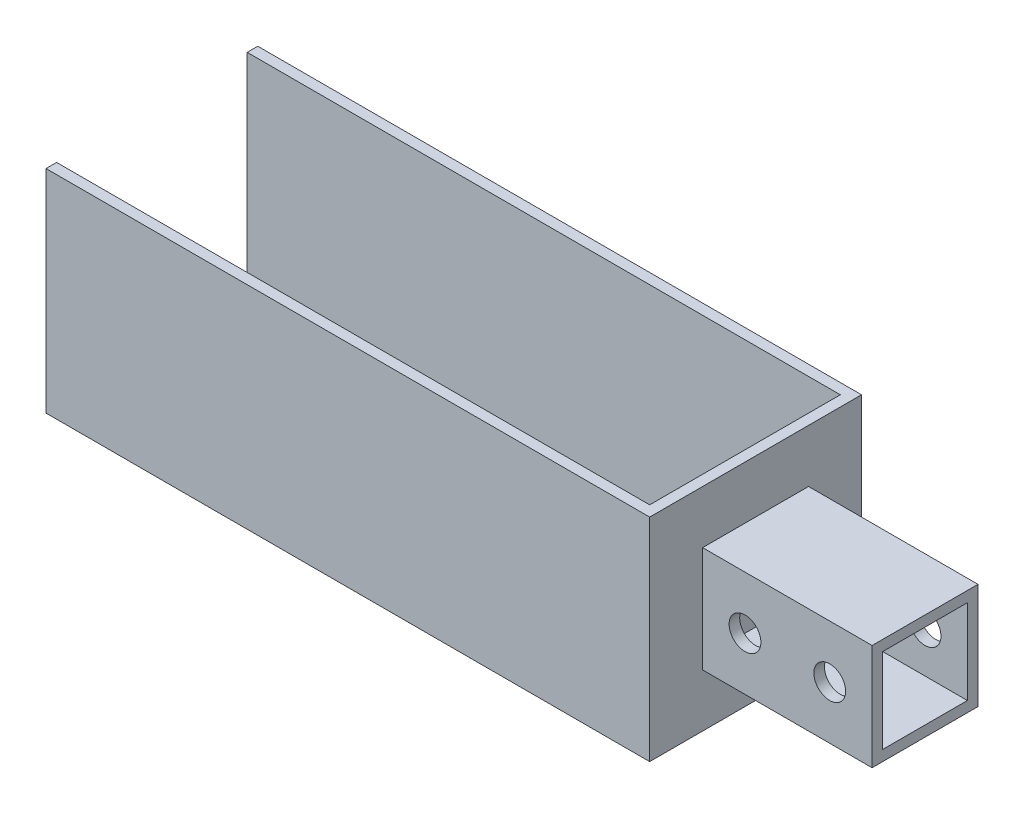
ISO-10303-21;
HEADER;
FILE_DESCRIPTION(('STEP AP214'),'2;1');
FILE_NAME('part.step','',(''),(''),'','','');
FILE_SCHEMA(('AUTOMOTIVE_DESIGN { 1 0 10303 214 1 1 1 1 }'));
ENDSEC;
DATA;
#1=APPLICATION_CONTEXT('core data for automotive mechanical design processes');
#2=APPLICATION_PROTOCOL_DEFINITION('international standard','automotive_design',2000,#1);
#3=PRODUCT_CONTEXT('',#1,'mechanical');
#4=PRODUCT('Part','Part','',(#3));
#5=PRODUCT_RELATED_PRODUCT_CATEGORY('part','',(#4));
#6=PRODUCT_DEFINITION_FORMATION('','',#4);
#7=PRODUCT_DEFINITION_CONTEXT('part definition',#1,'design');
#8=PRODUCT_DEFINITION('design','',#6,#7);
#9=PRODUCT_DEFINITION_SHAPE('','',#8);
#10=(LENGTH_UNIT() NAMED_UNIT(*) SI_UNIT(.MILLI.,.METRE.));
#11=(NAMED_UNIT(*) PLANE_ANGLE_UNIT() SI_UNIT($,.RADIAN.));
#12=(NAMED_UNIT(*) SI_UNIT($,.STERADIAN.) SOLID_ANGLE_UNIT());
#13=UNCERTAINTY_MEASURE_WITH_UNIT(LENGTH_MEASURE(1.E-05),#10,'distance_accuracy_value','');
#14=(GEOMETRIC_REPRESENTATION_CONTEXT(3) GLOBAL_UNCERTAINTY_ASSIGNED_CONTEXT((#13)) GLOBAL_UNIT_ASSIGNED_CONTEXT((#10,
#11,#12)) REPRESENTATION_CONTEXT('',''));
#15=CARTESIAN_POINT('',(0.,0.,0.));
#16=DIRECTION('',(0.,0.,1.));
#17=DIRECTION('',(1.,0.,0.));
#18=AXIS2_PLACEMENT_3D('',#15,#16,#17);
#19=CARTESIAN_POINT('',(50.8,0.,0.));
#20=DIRECTION('',(1.,0.,0.));
#21=DIRECTION('',(0.,0.,-1.));
#22=AXIS2_PLACEMENT_3D('',#19,#20,#21);
#23=PLANE('',#22);
#24=DIRECTION('',(0.,0.,-1.));
#25=VECTOR('',#24,1.);
#26=CARTESIAN_POINT('',(50.8,-18.6981530343008,9.45798153034302));
#27=LINE('',#26,#25);
#28=CARTESIAN_POINT('',(50.8,-18.6981530343008,9.45798153034302));
#29=VERTEX_POINT('',#28);
#30=CARTESIAN_POINT('',(50.8,-18.6981530343008,-22.292018469657));
#31=VERTEX_POINT('',#30);
#32=EDGE_CURVE('E271',#29,#31,#27,.T.);
#33=ORIENTED_EDGE('',*,*,#32,.T.);
#34=DIRECTION('',(0.,1.,0.));
#35=VECTOR('',#34,1.);
#36=CARTESIAN_POINT('',(50.8,-18.6981530343008,-22.292018469657));
#37=LINE('',#36,#35);
#38=CARTESIAN_POINT('',(50.8,13.0518469656992,-22.292018469657));
#39=VERTEX_POINT('',#38);
#40=EDGE_CURVE('E274',#31,#39,#37,.T.);
#41=ORIENTED_EDGE('',*,*,#40,.T.);
#42=DIRECTION('',(0.,0.,1.));
#43=VECTOR('',#42,1.);
#44=CARTESIAN_POINT('',(50.8,13.0518469656992,9.45798153034302));
#45=LINE('',#44,#43);
#46=CARTESIAN_POINT('',(50.8,13.0518469656992,9.45798153034302));
#47=VERTEX_POINT('',#46);
#48=EDGE_CURVE('E277',#39,#47,#45,.T.);
#49=ORIENTED_EDGE('',*,*,#48,.T.);
#50=DIRECTION('',(0.,-1.,0.));
#51=VECTOR('',#50,1.);
#52=CARTESIAN_POINT('',(50.8,-18.6981530343008,9.45798153034302));
#53=LINE('',#52,#51);
#54=EDGE_CURVE('E279',#47,#29,#53,.T.);
#55=ORIENTED_EDGE('',*,*,#54,.T.);
#56=EDGE_LOOP('',(#33,#41,#49,#55));
#57=FACE_BOUND('',#56,.T.);
#58=DIRECTION('',(0.,1.,0.));
#59=VECTOR('',#58,1.);
#60=CARTESIAN_POINT('',(50.8,-15.5231530343008,-19.117018469657));
#61=LINE('',#60,#59);
#62=CARTESIAN_POINT('',(50.8,-15.5231530343008,-19.117018469657));
#63=VERTEX_POINT('',#62);
#64=CARTESIAN_POINT('',(50.8,9.87684696569922,-19.117018469657));
#65=VERTEX_POINT('',#64);
#66=EDGE_CURVE('E243',#63,#65,#61,.T.);
#67=ORIENTED_EDGE('',*,*,#66,.F.);
#68=DIRECTION('',(0.,0.,-1.));
#69=VECTOR('',#68,1.);
#70=CARTESIAN_POINT('',(50.8,-15.5231530343008,6.28298153034302));
#71=LINE('',#70,#69);
#72=CARTESIAN_POINT('',(50.8,-15.5231530343008,6.28298153034302));
#73=VERTEX_POINT('',#72);
#74=EDGE_CURVE('E241',#73,#63,#71,.T.);
#75=ORIENTED_EDGE('',*,*,#74,.F.);
#76=DIRECTION('',(0.,-1.,0.));
#77=VECTOR('',#76,1.);
#78=CARTESIAN_POINT('',(50.8,-15.5231530343008,6.28298153034302));
#79=LINE('',#78,#77);
#80=CARTESIAN_POINT('',(50.8,9.87684696569922,6.28298153034302));
#81=VERTEX_POINT('',#80);
#82=EDGE_CURVE('E249',#81,#73,#79,.T.);
#83=ORIENTED_EDGE('',*,*,#82,.F.);
#84=DIRECTION('',(0.,0.,1.));
#85=VECTOR('',#84,1.);
#86=CARTESIAN_POINT('',(50.8,9.87684696569922,6.28298153034302));
#87=LINE('',#86,#85);
#88=EDGE_CURVE('E246',#65,#81,#87,.T.);
#89=ORIENTED_EDGE('',*,*,#88,.F.);
#90=EDGE_LOOP('',(#67,#75,#83,#89));
#91=FACE_BOUND('',#90,.T.);
#92=ADVANCED_FACE('F39',(#57,#91),#23,.T.);
#93=CARTESIAN_POINT('',(50.8,-18.6981530343008,9.45798153034302));
#94=DIRECTION('',(0.,1.,0.));
#95=DIRECTION('',(0.,0.,1.));
#96=AXIS2_PLACEMENT_3D('',#93,#94,#95);
#97=PLANE('',#96);
#98=DIRECTION('',(0.,0.,-1.));
#99=VECTOR('',#98,1.);
#100=CARTESIAN_POINT('',(0.,-18.6981530343008,9.45798153034302));
#101=LINE('',#100,#99);
#102=CARTESIAN_POINT('',(0.,-18.6981530343008,9.45798153034302));
#103=VERTEX_POINT('',#102);
#104=CARTESIAN_POINT('',(0.,-18.6981530343008,-22.292018469657));
#105=VERTEX_POINT('',#104);
#106=EDGE_CURVE('E270',#103,#105,#101,.T.);
#107=ORIENTED_EDGE('',*,*,#106,.T.);
#108=DIRECTION('',(-1.,0.,0.));
#109=VECTOR('',#108,1.);
#110=CARTESIAN_POINT('',(50.8,-18.6981530343008,-22.292018469657));
#111=LINE('',#110,#109);
#112=EDGE_CURVE('E11',#31,#105,#111,.T.);
#113=ORIENTED_EDGE('',*,*,#112,.F.);
#114=ORIENTED_EDGE('',*,*,#32,.F.);
#115=DIRECTION('',(-1.,0.,0.));
#116=VECTOR('',#115,1.);
#117=CARTESIAN_POINT('',(50.8,-18.6981530343008,9.45798153034302));
#118=LINE('',#117,#116);
#119=EDGE_CURVE('E281',#29,#103,#118,.T.);
#120=ORIENTED_EDGE('',*,*,#119,.T.);
#121=EDGE_LOOP('',(#107,#113,#114,#120));
#122=FACE_BOUND('',#121,.T.);
#123=ADVANCED_FACE('F41',(#122),#97,.F.);
#124=CARTESIAN_POINT('',(50.8,-18.6981530343008,-22.292018469657));
#125=DIRECTION('',(0.,0.,1.));
#126=DIRECTION('',(1.,0.,0.));
#127=AXIS2_PLACEMENT_3D('',#124,#125,#126);
#128=PLANE('',#127);
#129=CARTESIAN_POINT('',(38.1,-2.82315303430078,-22.292018469657));
#130=DIRECTION('',(0.,0.,1.));
#131=DIRECTION('',(1.,0.,0.));
#132=AXIS2_PLACEMENT_3D('',#129,#130,#131);
#133=CIRCLE('',#132,4.76249999999999);
#134=CARTESIAN_POINT('',(42.8625,-2.82315303430078,-22.292018469657));
#135=VERTEX_POINT('',#134);
#136=EDGE_CURVE('E213',#135,#135,#133,.T.);
#137=ORIENTED_EDGE('',*,*,#136,.T.);
#138=EDGE_LOOP('',(#137));
#139=FACE_BOUND('',#138,.T.);
#140=CARTESIAN_POINT('',(12.7,-2.82315303430078,-22.292018469657));
#141=DIRECTION('',(0.,0.,1.));
#142=DIRECTION('',(1.,0.,0.));
#143=AXIS2_PLACEMENT_3D('',#140,#141,#142);
#144=CIRCLE('',#143,4.76249999999999);
#145=CARTESIAN_POINT('',(17.4625,-2.82315303430078,-22.292018469657));
#146=VERTEX_POINT('',#145);
#147=EDGE_CURVE('E223',#146,#146,#144,.T.);
#148=ORIENTED_EDGE('',*,*,#147,.T.);
#149=EDGE_LOOP('',(#148));
#150=FACE_BOUND('',#149,.T.);
#151=DIRECTION('',(0.,1.,0.));
#152=VECTOR('',#151,1.);
#153=CARTESIAN_POINT('',(0.,-18.6981530343008,-22.292018469657));
#154=LINE('',#153,#152);
#155=CARTESIAN_POINT('',(0.,13.0518469656992,-22.292018469657));
#156=VERTEX_POINT('',#155);
#157=EDGE_CURVE('E284',#105,#156,#154,.T.);
#158=ORIENTED_EDGE('',*,*,#157,.T.);
#159=DIRECTION('',(-1.,0.,0.));
#160=VECTOR('',#159,1.);
#161=CARTESIAN_POINT('',(50.8,13.0518469656992,-22.292018469657));
#162=LINE('',#161,#160);
#163=EDGE_CURVE('E48',#39,#156,#162,.T.);
#164=ORIENTED_EDGE('',*,*,#163,.F.);
#165=ORIENTED_EDGE('',*,*,#40,.F.);
#166=ORIENTED_EDGE('',*,*,#112,.T.);
#167=EDGE_LOOP('',(#158,#164,#165,#166));
#168=FACE_BOUND('',#167,.T.);
#169=ADVANCED_FACE('F347',(#139,#150,#168),#128,.F.);
#170=CARTESIAN_POINT('',(50.8,13.0518469656992,9.45798153034302));
#171=DIRECTION('',(0.,-1.,0.));
#172=DIRECTION('',(0.,0.,-1.));
#173=AXIS2_PLACEMENT_3D('',#170,#171,#172);
#174=PLANE('',#173);
#175=DIRECTION('',(0.,0.,1.));
#176=VECTOR('',#175,1.);
#177=CARTESIAN_POINT('',(0.,13.0518469656992,9.45798153034302));
#178=LINE('',#177,#176);
#179=CARTESIAN_POINT('',(0.,13.0518469656992,9.45798153034302));
#180=VERTEX_POINT('',#179);
#181=EDGE_CURVE('E287',#156,#180,#178,.T.);
#182=ORIENTED_EDGE('',*,*,#181,.T.);
#183=DIRECTION('',(-1.,0.,0.));
#184=VECTOR('',#183,1.);
#185=CARTESIAN_POINT('',(50.8,13.0518469656992,9.45798153034302));
#186=LINE('',#185,#184);
#187=EDGE_CURVE('E294',#47,#180,#186,.T.);
#188=ORIENTED_EDGE('',*,*,#187,.F.);
#189=ORIENTED_EDGE('',*,*,#48,.F.);
#190=ORIENTED_EDGE('',*,*,#163,.T.);
#191=EDGE_LOOP('',(#182,#188,#189,#190));
#192=FACE_BOUND('',#191,.T.);
#193=ADVANCED_FACE('F351',(#192),#174,.F.);
#194=CARTESIAN_POINT('',(50.8,-18.6981530343008,9.45798153034302));
#195=DIRECTION('',(0.,0.,-1.));
#196=DIRECTION('',(-1.,0.,0.));
#197=AXIS2_PLACEMENT_3D('',#194,#195,#196);
#198=PLANE('',#197);
#199=CARTESIAN_POINT('',(38.1,-2.82315303430078,9.45798153034302));
#200=DIRECTION('',(0.,0.,1.));
#201=DIRECTION('',(1.,0.,0.));
#202=AXIS2_PLACEMENT_3D('',#199,#200,#201);
#203=CIRCLE('',#202,4.76249999999999);
#204=CARTESIAN_POINT('',(42.8625,-2.82315303430078,9.45798153034302));
#205=VERTEX_POINT('',#204);
#206=EDGE_CURVE('E207',#205,#205,#203,.T.);
#207=ORIENTED_EDGE('',*,*,#206,.F.);
#208=EDGE_LOOP('',(#207));
#209=FACE_BOUND('',#208,.T.);
#210=CARTESIAN_POINT('',(12.7,-2.82315303430078,9.45798153034302));
#211=DIRECTION('',(0.,0.,1.));
#212=DIRECTION('',(1.,0.,0.));
#213=AXIS2_PLACEMENT_3D('',#210,#211,#212);
#214=CIRCLE('',#213,4.76249999999999);
#215=CARTESIAN_POINT('',(17.4625,-2.82315303430078,9.45798153034302));
#216=VERTEX_POINT('',#215);
#217=EDGE_CURVE('E216',#216,#216,#214,.T.);
#218=ORIENTED_EDGE('',*,*,#217,.F.);
#219=EDGE_LOOP('',(#218));
#220=FACE_BOUND('',#219,.T.);
#221=DIRECTION('',(0.,-1.,0.));
#222=VECTOR('',#221,1.);
#223=CARTESIAN_POINT('',(0.,-18.6981530343008,9.45798153034302));
#224=LINE('',#223,#222);
#225=EDGE_CURVE('E275',#180,#103,#224,.T.);
#226=ORIENTED_EDGE('',*,*,#225,.T.);
#227=ORIENTED_EDGE('',*,*,#119,.F.);
#228=ORIENTED_EDGE('',*,*,#54,.F.);
#229=ORIENTED_EDGE('',*,*,#187,.T.);
#230=EDGE_LOOP('',(#226,#227,#228,#229));
#231=FACE_BOUND('',#230,.T.);
#232=ADVANCED_FACE('F337',(#209,#220,#231),#198,.F.);
#233=CARTESIAN_POINT('',(50.8,-15.5231530343008,6.28298153034302));
#234=DIRECTION('',(0.,1.,0.));
#235=DIRECTION('',(0.,0.,1.));
#236=AXIS2_PLACEMENT_3D('',#233,#234,#235);
#237=PLANE('',#236);
#238=DIRECTION('',(0.,0.,-1.));
#239=VECTOR('',#238,1.);
#240=CARTESIAN_POINT('',(0.,-15.5231530343008,6.28298153034302));
#241=LINE('',#240,#239);
#242=CARTESIAN_POINT('',(0.,-15.5231530343008,6.28298153034302));
#243=VERTEX_POINT('',#242);
#244=CARTESIAN_POINT('',(0.,-15.5231530343008,-19.117018469657));
#245=VERTEX_POINT('',#244);
#246=EDGE_CURVE('E240',#243,#245,#241,.T.);
#247=ORIENTED_EDGE('',*,*,#246,.F.);
#248=DIRECTION('',(-1.,0.,0.));
#249=VECTOR('',#248,1.);
#250=CARTESIAN_POINT('',(50.8,-15.5231530343008,6.28298153034302));
#251=LINE('',#250,#249);
#252=EDGE_CURVE('E251',#73,#243,#251,.T.);
#253=ORIENTED_EDGE('',*,*,#252,.F.);
#254=ORIENTED_EDGE('',*,*,#74,.T.);
#255=DIRECTION('',(-1.,0.,0.));
#256=VECTOR('',#255,1.);
#257=CARTESIAN_POINT('',(50.8,-15.5231530343008,-19.117018469657));
#258=LINE('',#257,#256);
#259=EDGE_CURVE('E267',#63,#245,#258,.T.);
#260=ORIENTED_EDGE('',*,*,#259,.T.);
#261=EDGE_LOOP('',(#247,#253,#254,#260));
#262=FACE_BOUND('',#261,.T.);
#263=ADVANCED_FACE('F324',(#262),#237,.T.);
#264=CARTESIAN_POINT('',(50.8,-15.5231530343008,-19.117018469657));
#265=DIRECTION('',(0.,0.,1.));
#266=DIRECTION('',(1.,0.,0.));
#267=AXIS2_PLACEMENT_3D('',#264,#265,#266);
#268=PLANE('',#267);
#269=CARTESIAN_POINT('',(38.1,-2.82315303430078,-19.117018469657));
#270=DIRECTION('',(0.,0.,1.));
#271=DIRECTION('',(1.,0.,0.));
#272=AXIS2_PLACEMENT_3D('',#269,#270,#271);
#273=CIRCLE('',#272,4.76249999999999);
#274=CARTESIAN_POINT('',(42.8625,-2.82315303430078,-19.117018469657));
#275=VERTEX_POINT('',#274);
#276=EDGE_CURVE('E210',#275,#275,#273,.T.);
#277=ORIENTED_EDGE('',*,*,#276,.F.);
#278=EDGE_LOOP('',(#277));
#279=FACE_BOUND('',#278,.T.);
#280=CARTESIAN_POINT('',(12.7,-2.82315303430078,-19.117018469657));
#281=DIRECTION('',(0.,0.,1.));
#282=DIRECTION('',(1.,0.,0.));
#283=AXIS2_PLACEMENT_3D('',#280,#281,#282);
#284=CIRCLE('',#283,4.76249999999999);
#285=CARTESIAN_POINT('',(17.4625,-2.82315303430078,-19.117018469657));
#286=VERTEX_POINT('',#285);
#287=EDGE_CURVE('E220',#286,#286,#284,.T.);
#288=ORIENTED_EDGE('',*,*,#287,.F.);
#289=EDGE_LOOP('',(#288));
#290=FACE_BOUND('',#289,.T.);
#291=DIRECTION('',(0.,1.,0.));
#292=VECTOR('',#291,1.);
#293=CARTESIAN_POINT('',(0.,-15.5231530343008,-19.117018469657));
#294=LINE('',#293,#292);
#295=CARTESIAN_POINT('',(0.,9.87684696569922,-19.117018469657));
#296=VERTEX_POINT('',#295);
#297=EDGE_CURVE('E254',#245,#296,#294,.T.);
#298=ORIENTED_EDGE('',*,*,#297,.F.);
#299=ORIENTED_EDGE('',*,*,#259,.F.);
#300=ORIENTED_EDGE('',*,*,#66,.T.);
#301=DIRECTION('',(-1.,0.,0.));
#302=VECTOR('',#301,1.);
#303=CARTESIAN_POINT('',(50.8,9.87684696569922,-19.117018469657));
#304=LINE('',#303,#302);
#305=EDGE_CURVE('E265',#65,#296,#304,.T.);
#306=ORIENTED_EDGE('',*,*,#305,.T.);
#307=EDGE_LOOP('',(#298,#299,#300,#306));
#308=FACE_BOUND('',#307,.T.);
#309=ADVANCED_FACE('F327',(#279,#290,#308),#268,.T.);
#310=CARTESIAN_POINT('',(50.8,9.87684696569922,6.28298153034302));
#311=DIRECTION('',(0.,-1.,0.));
#312=DIRECTION('',(0.,0.,-1.));
#313=AXIS2_PLACEMENT_3D('',#310,#311,#312);
#314=PLANE('',#313);
#315=DIRECTION('',(0.,0.,1.));
#316=VECTOR('',#315,1.);
#317=CARTESIAN_POINT('',(0.,9.87684696569922,6.28298153034302));
#318=LINE('',#317,#316);
#319=CARTESIAN_POINT('',(0.,9.87684696569922,6.28298153034302));
#320=VERTEX_POINT('',#319);
#321=EDGE_CURVE('E257',#296,#320,#318,.T.);
#322=ORIENTED_EDGE('',*,*,#321,.F.);
#323=ORIENTED_EDGE('',*,*,#305,.F.);
#324=ORIENTED_EDGE('',*,*,#88,.T.);
#325=DIRECTION('',(-1.,0.,0.));
#326=VECTOR('',#325,1.);
#327=CARTESIAN_POINT('',(50.8,9.87684696569922,6.28298153034302));
#328=LINE('',#327,#326);
#329=EDGE_CURVE('E263',#81,#320,#328,.T.);
#330=ORIENTED_EDGE('',*,*,#329,.T.);
#331=EDGE_LOOP('',(#322,#323,#324,#330));
#332=FACE_BOUND('',#331,.T.);
#333=ADVANCED_FACE('F308',(#332),#314,.T.);
#334=CARTESIAN_POINT('',(50.8,-15.5231530343008,6.28298153034302));
#335=DIRECTION('',(0.,0.,-1.));
#336=DIRECTION('',(-1.,0.,0.));
#337=AXIS2_PLACEMENT_3D('',#334,#335,#336);
#338=PLANE('',#337);
#339=CARTESIAN_POINT('',(38.1,-2.82315303430078,6.28298153034302));
#340=DIRECTION('',(0.,0.,-1.));
#341=DIRECTION('',(-1.,0.,0.));
#342=AXIS2_PLACEMENT_3D('',#339,#340,#341);
#343=CIRCLE('',#342,4.76249999999999);
#344=CARTESIAN_POINT('',(33.3375,-2.82315303430078,6.28298153034302));
#345=VERTEX_POINT('',#344);
#346=EDGE_CURVE('E43',#345,#345,#343,.T.);
#347=ORIENTED_EDGE('',*,*,#346,.F.);
#348=EDGE_LOOP('',(#347));
#349=FACE_BOUND('',#348,.T.);
#350=CARTESIAN_POINT('',(12.7,-2.82315303430078,6.28298153034302));
#351=DIRECTION('',(0.,0.,-1.));
#352=DIRECTION('',(-1.,0.,0.));
#353=AXIS2_PLACEMENT_3D('',#350,#351,#352);
#354=CIRCLE('',#353,4.76249999999999);
#355=CARTESIAN_POINT('',(7.93750000000001,-2.82315303430078,6.28298153034302));
#356=VERTEX_POINT('',#355);
#357=EDGE_CURVE('E219',#356,#356,#354,.T.);
#358=ORIENTED_EDGE('',*,*,#357,.F.);
#359=EDGE_LOOP('',(#358));
#360=FACE_BOUND('',#359,.T.);
#361=DIRECTION('',(0.,-1.,0.));
#362=VECTOR('',#361,1.);
#363=CARTESIAN_POINT('',(0.,-15.5231530343008,6.28298153034302));
#364=LINE('',#363,#362);
#365=EDGE_CURVE('E244',#320,#243,#364,.T.);
#366=ORIENTED_EDGE('',*,*,#365,.F.);
#367=ORIENTED_EDGE('',*,*,#329,.F.);
#368=ORIENTED_EDGE('',*,*,#82,.T.);
#369=ORIENTED_EDGE('',*,*,#252,.T.);
#370=EDGE_LOOP('',(#366,#367,#368,#369));
#371=FACE_BOUND('',#370,.T.);
#372=ADVANCED_FACE('F304',(#349,#360,#371),#338,.T.);
#373=CARTESIAN_POINT('',(0.,0.,0.));
#374=DIRECTION('',(-1.,0.,0.));
#375=DIRECTION('',(0.,0.,1.));
#376=AXIS2_PLACEMENT_3D('',#373,#374,#375);
#377=PLANE('',#376);
#378=ORIENTED_EDGE('',*,*,#365,.T.);
#379=ORIENTED_EDGE('',*,*,#246,.T.);
#380=ORIENTED_EDGE('',*,*,#297,.T.);
#381=ORIENTED_EDGE('',*,*,#321,.T.);
#382=EDGE_LOOP('',(#378,#379,#380,#381));
#383=FACE_BOUND('',#382,.T.);
#384=ADVANCED_FACE('F307',(#383),#377,.F.);
#385=CARTESIAN_POINT('',(-3.175,28.9268469656992,25.332981530343));
#386=DIRECTION('',(0.,-1.,0.));
#387=DIRECTION('',(0.,0.,-1.));
#388=AXIS2_PLACEMENT_3D('',#385,#386,#387);
#389=PLANE('',#388);
#390=DIRECTION('',(0.,0.,-1.));
#391=VECTOR('',#390,1.);
#392=CARTESIAN_POINT('',(0.,28.9268469656992,25.332981530343));
#393=LINE('',#392,#391);
#394=CARTESIAN_POINT('',(0.,28.9268469656992,25.332981530343));
#395=VERTEX_POINT('',#394);
#396=CARTESIAN_POINT('',(0.,28.9268469656992,-38.167018469657));
#397=VERTEX_POINT('',#396);
#398=EDGE_CURVE('E226',#395,#397,#393,.T.);
#399=ORIENTED_EDGE('',*,*,#398,.T.);
#400=DIRECTION('',(1.,0.,0.));
#401=VECTOR('',#400,1.);
#402=CARTESIAN_POINT('',(-3.175,28.9268469656992,-38.167018469657));
#403=LINE('',#402,#401);
#404=CARTESIAN_POINT('',(-180.975,28.9268469656992,-38.167018469657));
#405=VERTEX_POINT('',#404);
#406=EDGE_CURVE('E161',#405,#397,#403,.T.);
#407=ORIENTED_EDGE('',*,*,#406,.F.);
#408=DIRECTION('',(0.,0.,-1.));
#409=VECTOR('',#408,1.);
#410=CARTESIAN_POINT('',(-180.975,28.9268469656992,-38.167018469657));
#411=LINE('',#410,#409);
#412=CARTESIAN_POINT('',(-180.975,28.9268469656992,-34.992018469657));
#413=VERTEX_POINT('',#412);
#414=EDGE_CURVE('E176',#413,#405,#411,.T.);
#415=ORIENTED_EDGE('',*,*,#414,.F.);
#416=DIRECTION('',(1.,0.,0.));
#417=VECTOR('',#416,1.);
#418=CARTESIAN_POINT('',(-180.975,28.9268469656992,-34.992018469657));
#419=LINE('',#418,#417);
#420=CARTESIAN_POINT('',(-3.175,28.9268469656992,-34.992018469657));
#421=VERTEX_POINT('',#420);
#422=EDGE_CURVE('E191',#413,#421,#419,.T.);
#423=ORIENTED_EDGE('',*,*,#422,.T.);
#424=DIRECTION('',(0.,0.,-1.));
#425=VECTOR('',#424,1.);
#426=CARTESIAN_POINT('',(-3.175,28.9268469656992,25.332981530343));
#427=LINE('',#426,#425);
#428=CARTESIAN_POINT('',(-3.175,28.9268469656992,22.157981530343));
#429=VERTEX_POINT('',#428);
#430=EDGE_CURVE('E61',#429,#421,#427,.T.);
#431=ORIENTED_EDGE('',*,*,#430,.F.);
#432=DIRECTION('',(1.,0.,0.));
#433=VECTOR('',#432,1.);
#434=CARTESIAN_POINT('',(-180.975,28.9268469656992,22.157981530343));
#435=LINE('',#434,#433);
#436=CARTESIAN_POINT('',(-180.975,28.9268469656992,22.157981530343));
#437=VERTEX_POINT('',#436);
#438=EDGE_CURVE('E204',#437,#429,#435,.T.);
#439=ORIENTED_EDGE('',*,*,#438,.F.);
#440=DIRECTION('',(0.,0.,-1.));
#441=VECTOR('',#440,1.);
#442=CARTESIAN_POINT('',(-180.975,28.9268469656992,22.157981530343));
#443=LINE('',#442,#441);
#444=CARTESIAN_POINT('',(-180.975,28.9268469656992,25.332981530343));
#445=VERTEX_POINT('',#444);
#446=EDGE_CURVE('E182',#445,#437,#443,.T.);
#447=ORIENTED_EDGE('',*,*,#446,.F.);
#448=DIRECTION('',(1.,0.,0.));
#449=VECTOR('',#448,1.);
#450=CARTESIAN_POINT('',(-3.175,28.9268469656992,25.332981530343));
#451=LINE('',#450,#449);
#452=EDGE_CURVE('E228',#445,#395,#451,.T.);
#453=ORIENTED_EDGE('',*,*,#452,.T.);
#454=EDGE_LOOP('',(#399,#407,#415,#423,#431,#439,#447,#453));
#455=FACE_BOUND('',#454,.T.);
#456=ADVANCED_FACE('F380',(#455),#389,.F.);
#457=CARTESIAN_POINT('',(-3.175,28.9268469656992,-38.167018469657));
#458=DIRECTION('',(0.,0.,1.));
#459=DIRECTION('',(1.,0.,0.));
#460=AXIS2_PLACEMENT_3D('',#457,#458,#459);
#461=PLANE('',#460);
#462=DIRECTION('',(0.,-1.,0.));
#463=VECTOR('',#462,1.);
#464=CARTESIAN_POINT('',(0.,28.9268469656992,-38.167018469657));
#465=LINE('',#464,#463);
#466=CARTESIAN_POINT('',(0.,-34.5731530343008,-38.167018469657));
#467=VERTEX_POINT('',#466);
#468=EDGE_CURVE('E158',#397,#467,#465,.T.);
#469=ORIENTED_EDGE('',*,*,#468,.T.);
#470=DIRECTION('',(1.,0.,0.));
#471=VECTOR('',#470,1.);
#472=CARTESIAN_POINT('',(-3.175,-34.5731530343008,-38.167018469657));
#473=LINE('',#472,#471);
#474=CARTESIAN_POINT('',(-180.975,-34.5731530343008,-38.167018469657));
#475=VERTEX_POINT('',#474);
#476=EDGE_CURVE('E152',#475,#467,#473,.T.);
#477=ORIENTED_EDGE('',*,*,#476,.F.);
#478=DIRECTION('',(0.,-1.,0.));
#479=VECTOR('',#478,1.);
#480=CARTESIAN_POINT('',(-180.975,28.9268469656992,-38.167018469657));
#481=LINE('',#480,#479);
#482=EDGE_CURVE('E157',#405,#475,#481,.T.);
#483=ORIENTED_EDGE('',*,*,#482,.F.);
#484=ORIENTED_EDGE('',*,*,#406,.T.);
#485=EDGE_LOOP('',(#469,#477,#483,#484));
#486=FACE_BOUND('',#485,.T.);
#487=ADVANCED_FACE('F154',(#486),#461,.F.);
#488=CARTESIAN_POINT('',(-3.175,-34.5731530343008,25.332981530343));
#489=DIRECTION('',(0.,1.,0.));
#490=DIRECTION('',(0.,0.,1.));
#491=AXIS2_PLACEMENT_3D('',#488,#489,#490);
#492=PLANE('',#491);
#493=DIRECTION('',(0.,0.,1.));
#494=VECTOR('',#493,1.);
#495=CARTESIAN_POINT('',(0.,-34.5731530343008,25.332981530343));
#496=LINE('',#495,#494);
#497=CARTESIAN_POINT('',(0.,-34.5731530343008,25.332981530343));
#498=VERTEX_POINT('',#497);
#499=EDGE_CURVE('E233',#467,#498,#496,.T.);
#500=ORIENTED_EDGE('',*,*,#499,.T.);
#501=DIRECTION('',(1.,0.,0.));
#502=VECTOR('',#501,1.);
#503=CARTESIAN_POINT('',(-3.175,-34.5731530343008,25.332981530343));
#504=LINE('',#503,#502);
#505=CARTESIAN_POINT('',(-180.975,-34.5731530343008,25.332981530343));
#506=VERTEX_POINT('',#505);
#507=EDGE_CURVE('E162',#506,#498,#504,.T.);
#508=ORIENTED_EDGE('',*,*,#507,.F.);
#509=DIRECTION('',(0.,0.,1.));
#510=VECTOR('',#509,1.);
#511=CARTESIAN_POINT('',(-180.975,-34.5731530343008,-38.167018469657));
#512=LINE('',#511,#510);
#513=EDGE_CURVE('E165',#475,#506,#512,.T.);
#514=ORIENTED_EDGE('',*,*,#513,.F.);
#515=ORIENTED_EDGE('',*,*,#476,.T.);
#516=EDGE_LOOP('',(#500,#508,#514,#515));
#517=FACE_BOUND('',#516,.T.);
#518=ADVANCED_FACE('F166',(#517),#492,.F.);
#519=CARTESIAN_POINT('',(-3.175,28.9268469656992,25.332981530343));
#520=DIRECTION('',(0.,0.,-1.));
#521=DIRECTION('',(-1.,0.,0.));
#522=AXIS2_PLACEMENT_3D('',#519,#520,#521);
#523=PLANE('',#522);
#524=DIRECTION('',(0.,1.,0.));
#525=VECTOR('',#524,1.);
#526=CARTESIAN_POINT('',(0.,28.9268469656992,25.332981530343));
#527=LINE('',#526,#525);
#528=EDGE_CURVE('E229',#498,#395,#527,.T.);
#529=ORIENTED_EDGE('',*,*,#528,.T.);
#530=ORIENTED_EDGE('',*,*,#452,.F.);
#531=DIRECTION('',(0.,1.,0.));
#532=VECTOR('',#531,1.);
#533=CARTESIAN_POINT('',(-180.975,28.9268469656992,25.332981530343));
#534=LINE('',#533,#532);
#535=EDGE_CURVE('E171',#506,#445,#534,.T.);
#536=ORIENTED_EDGE('',*,*,#535,.F.);
#537=ORIENTED_EDGE('',*,*,#507,.T.);
#538=EDGE_LOOP('',(#529,#530,#536,#537));
#539=FACE_BOUND('',#538,.T.);
#540=ADVANCED_FACE('F384',(#539),#523,.F.);
#541=CARTESIAN_POINT('',(-3.175,0.,0.));
#542=DIRECTION('',(-1.,0.,0.));
#543=DIRECTION('',(0.,0.,1.));
#544=AXIS2_PLACEMENT_3D('',#541,#542,#543);
#545=PLANE('',#544);
#546=DIRECTION('',(0.,1.,0.));
#547=VECTOR('',#546,1.);
#548=CARTESIAN_POINT('',(-3.175,28.9268469656992,-34.992018469657));
#549=LINE('',#548,#547);
#550=CARTESIAN_POINT('',(-3.175,-31.3981530343008,-34.992018469657));
#551=VERTEX_POINT('',#550);
#552=EDGE_CURVE('E56',#551,#421,#549,.T.);
#553=ORIENTED_EDGE('',*,*,#552,.F.);
#554=DIRECTION('',(0.,0.,-1.));
#555=VECTOR('',#554,1.);
#556=CARTESIAN_POINT('',(-3.175,-31.3981530343008,-34.992018469657));
#557=LINE('',#556,#555);
#558=CARTESIAN_POINT('',(-3.175,-31.3981530343008,22.157981530343));
#559=VERTEX_POINT('',#558);
#560=EDGE_CURVE('E178',#559,#551,#557,.T.);
#561=ORIENTED_EDGE('',*,*,#560,.F.);
#562=DIRECTION('',(0.,-1.,0.));
#563=VECTOR('',#562,1.);
#564=CARTESIAN_POINT('',(-3.175,28.9268469656992,22.157981530343));
#565=LINE('',#564,#563);
#566=EDGE_CURVE('E192',#429,#559,#565,.T.);
#567=ORIENTED_EDGE('',*,*,#566,.F.);
#568=ORIENTED_EDGE('',*,*,#430,.T.);
#569=EDGE_LOOP('',(#553,#561,#567,#568));
#570=FACE_BOUND('',#569,.T.);
#571=ADVANCED_FACE('F375',(#570),#545,.T.);
#572=ORIENTED_EDGE('',*,*,#106,.F.);
#573=ORIENTED_EDGE('',*,*,#225,.F.);
#574=ORIENTED_EDGE('',*,*,#181,.F.);
#575=ORIENTED_EDGE('',*,*,#157,.F.);
#576=EDGE_LOOP('',(#572,#573,#574,#575));
#577=FACE_BOUND('',#576,.T.);
#578=ORIENTED_EDGE('',*,*,#398,.F.);
#579=ORIENTED_EDGE('',*,*,#528,.F.);
#580=ORIENTED_EDGE('',*,*,#499,.F.);
#581=ORIENTED_EDGE('',*,*,#468,.F.);
#582=EDGE_LOOP('',(#578,#579,#580,#581));
#583=FACE_BOUND('',#582,.T.);
#584=ADVANCED_FACE('F372',(#577,#583),#377,.F.);
#585=CARTESIAN_POINT('',(12.7,-2.82315303430078,9.45798153034302));
#586=DIRECTION('',(0.,0.,1.));
#587=DIRECTION('',(1.,0.,0.));
#588=AXIS2_PLACEMENT_3D('',#585,#586,#587);
#589=CYLINDRICAL_SURFACE('',#588,4.76249999999999);
#590=ORIENTED_EDGE('',*,*,#357,.T.);
#591=EDGE_LOOP('',(#590));
#592=FACE_BOUND('',#591,.T.);
#593=ORIENTED_EDGE('',*,*,#217,.T.);
#594=EDGE_LOOP('',(#593));
#595=FACE_BOUND('',#594,.T.);
#596=ADVANCED_FACE('F301',(#592,#595),#589,.F.);
#597=ORIENTED_EDGE('',*,*,#287,.T.);
#598=EDGE_LOOP('',(#597));
#599=FACE_BOUND('',#598,.T.);
#600=ORIENTED_EDGE('',*,*,#147,.F.);
#601=EDGE_LOOP('',(#600));
#602=FACE_BOUND('',#601,.T.);
#603=ADVANCED_FACE('F412',(#599,#602),#589,.F.);
#604=CARTESIAN_POINT('',(38.1,-2.82315303430078,9.45798153034302));
#605=DIRECTION('',(0.,0.,1.));
#606=DIRECTION('',(1.,0.,0.));
#607=AXIS2_PLACEMENT_3D('',#604,#605,#606);
#608=CYLINDRICAL_SURFACE('',#607,4.76249999999999);
#609=ORIENTED_EDGE('',*,*,#346,.T.);
#610=EDGE_LOOP('',(#609));
#611=FACE_BOUND('',#610,.T.);
#612=ORIENTED_EDGE('',*,*,#206,.T.);
#613=EDGE_LOOP('',(#612));
#614=FACE_BOUND('',#613,.T.);
#615=ADVANCED_FACE('F409',(#611,#614),#608,.F.);
#616=ORIENTED_EDGE('',*,*,#276,.T.);
#617=EDGE_LOOP('',(#616));
#618=FACE_BOUND('',#617,.T.);
#619=ORIENTED_EDGE('',*,*,#136,.F.);
#620=EDGE_LOOP('',(#619));
#621=FACE_BOUND('',#620,.T.);
#622=ADVANCED_FACE('F408',(#618,#621),#608,.F.);
#623=CARTESIAN_POINT('',(-180.975,28.9268469656992,22.157981530343));
#624=DIRECTION('',(0.,0.,1.));
#625=DIRECTION('',(0.,-1.,0.));
#626=AXIS2_PLACEMENT_3D('',#623,#624,#625);
#627=PLANE('',#626);
#628=ORIENTED_EDGE('',*,*,#566,.T.);
#629=DIRECTION('',(1.,0.,0.));
#630=VECTOR('',#629,1.);
#631=CARTESIAN_POINT('',(-180.975,-31.3981530343008,22.157981530343));
#632=LINE('',#631,#630);
#633=CARTESIAN_POINT('',(-180.975,-31.3981530343008,22.157981530343));
#634=VERTEX_POINT('',#633);
#635=EDGE_CURVE('E201',#634,#559,#632,.T.);
#636=ORIENTED_EDGE('',*,*,#635,.F.);
#637=DIRECTION('',(0.,-1.,0.));
#638=VECTOR('',#637,1.);
#639=CARTESIAN_POINT('',(-180.975,28.9268469656992,22.157981530343));
#640=LINE('',#639,#638);
#641=EDGE_CURVE('E184',#437,#634,#640,.T.);
#642=ORIENTED_EDGE('',*,*,#641,.F.);
#643=ORIENTED_EDGE('',*,*,#438,.T.);
#644=EDGE_LOOP('',(#628,#636,#642,#643));
#645=FACE_BOUND('',#644,.T.);
#646=ADVANCED_FACE('F388',(#645),#627,.F.);
#647=CARTESIAN_POINT('',(-180.975,-31.3981530343008,-34.992018469657));
#648=DIRECTION('',(0.,-1.,0.));
#649=DIRECTION('',(0.,0.,-1.));
#650=AXIS2_PLACEMENT_3D('',#647,#648,#649);
#651=PLANE('',#650);
#652=ORIENTED_EDGE('',*,*,#560,.T.);
#653=DIRECTION('',(1.,0.,0.));
#654=VECTOR('',#653,1.);
#655=CARTESIAN_POINT('',(-180.975,-31.3981530343008,-34.992018469657));
#656=LINE('',#655,#654);
#657=CARTESIAN_POINT('',(-180.975,-31.3981530343008,-34.992018469657));
#658=VERTEX_POINT('',#657);
#659=EDGE_CURVE('E198',#658,#551,#656,.T.);
#660=ORIENTED_EDGE('',*,*,#659,.F.);
#661=DIRECTION('',(0.,0.,-1.));
#662=VECTOR('',#661,1.);
#663=CARTESIAN_POINT('',(-180.975,-31.3981530343008,-34.992018469657));
#664=LINE('',#663,#662);
#665=EDGE_CURVE('E186',#634,#658,#664,.T.);
#666=ORIENTED_EDGE('',*,*,#665,.F.);
#667=ORIENTED_EDGE('',*,*,#635,.T.);
#668=EDGE_LOOP('',(#652,#660,#666,#667));
#669=FACE_BOUND('',#668,.T.);
#670=ADVANCED_FACE('F392',(#669),#651,.F.);
#671=CARTESIAN_POINT('',(-180.975,28.9268469656992,-34.992018469657));
#672=DIRECTION('',(0.,0.,-1.));
#673=DIRECTION('',(0.,1.,0.));
#674=AXIS2_PLACEMENT_3D('',#671,#672,#673);
#675=PLANE('',#674);
#676=ORIENTED_EDGE('',*,*,#552,.T.);
#677=ORIENTED_EDGE('',*,*,#422,.F.);
#678=DIRECTION('',(0.,1.,0.));
#679=VECTOR('',#678,1.);
#680=CARTESIAN_POINT('',(-180.975,28.9268469656992,-34.992018469657));
#681=LINE('',#680,#679);
#682=EDGE_CURVE('E188',#658,#413,#681,.T.);
#683=ORIENTED_EDGE('',*,*,#682,.F.);
#684=ORIENTED_EDGE('',*,*,#659,.T.);
#685=EDGE_LOOP('',(#676,#677,#683,#684));
#686=FACE_BOUND('',#685,.T.);
#687=ADVANCED_FACE('F396',(#686),#675,.F.);
#688=CARTESIAN_POINT('',(-180.975,0.,0.));
#689=DIRECTION('',(-1.,0.,0.));
#690=DIRECTION('',(0.,0.,1.));
#691=AXIS2_PLACEMENT_3D('',#688,#689,#690);
#692=PLANE('',#691);
#693=ORIENTED_EDGE('',*,*,#482,.T.);
#694=ORIENTED_EDGE('',*,*,#513,.T.);
#695=ORIENTED_EDGE('',*,*,#535,.T.);
#696=ORIENTED_EDGE('',*,*,#446,.T.);
#697=ORIENTED_EDGE('',*,*,#641,.T.);
#698=ORIENTED_EDGE('',*,*,#665,.T.);
#699=ORIENTED_EDGE('',*,*,#682,.T.);
#700=ORIENTED_EDGE('',*,*,#414,.T.);
#701=EDGE_LOOP('',(#693,#694,#695,#696,#697,#698,#699,#700));
#702=FACE_BOUND('',#701,.T.);
#703=ADVANCED_FACE('F174',(#702),#692,.T.);
#704=CLOSED_SHELL('',(#92,#123,#169,#193,#232,#263,#309,#333,#372,#384,#456,#487,#518,#540,#571,
#584,#596,#603,#615,#622,#646,#670,#687,#703));
#705=MANIFOLD_SOLID_BREP('B2',#704);
#706=ADVANCED_BREP_SHAPE_REPRESENTATION('',(#18,#705),#14);
#707=SHAPE_DEFINITION_REPRESENTATION(#9,#706);
ENDSEC;
END-ISO-10303-21;
